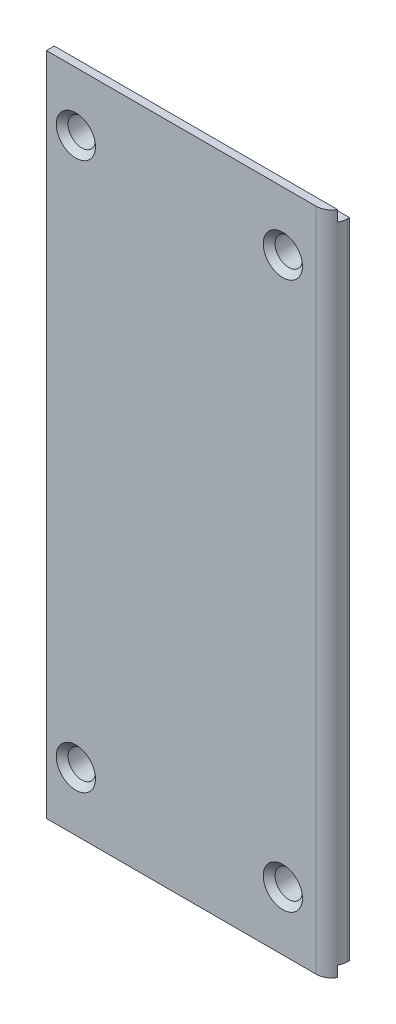
ISO-10303-21;
HEADER;
FILE_DESCRIPTION(('STEP AP214'),'2;1');
FILE_NAME('part.step','',(''),(''),'','','');
FILE_SCHEMA(('AUTOMOTIVE_DESIGN { 1 0 10303 214 1 1 1 1 }'));
ENDSEC;
DATA;
#1=APPLICATION_CONTEXT('core data for automotive mechanical design processes');
#2=APPLICATION_PROTOCOL_DEFINITION('international standard','automotive_design',2000,#1);
#3=PRODUCT_CONTEXT('',#1,'mechanical');
#4=PRODUCT('Part','Part','',(#3));
#5=PRODUCT_RELATED_PRODUCT_CATEGORY('part','',(#4));
#6=PRODUCT_DEFINITION_FORMATION('','',#4);
#7=PRODUCT_DEFINITION_CONTEXT('part definition',#1,'design');
#8=PRODUCT_DEFINITION('design','',#6,#7);
#9=PRODUCT_DEFINITION_SHAPE('','',#8);
#10=(LENGTH_UNIT() NAMED_UNIT(*) SI_UNIT(.MILLI.,.METRE.));
#11=(NAMED_UNIT(*) PLANE_ANGLE_UNIT() SI_UNIT($,.RADIAN.));
#12=(NAMED_UNIT(*) SI_UNIT($,.STERADIAN.) SOLID_ANGLE_UNIT());
#13=UNCERTAINTY_MEASURE_WITH_UNIT(LENGTH_MEASURE(1.E-05),#10,'distance_accuracy_value','');
#14=(GEOMETRIC_REPRESENTATION_CONTEXT(3) GLOBAL_UNCERTAINTY_ASSIGNED_CONTEXT((#13)) GLOBAL_UNIT_ASSIGNED_CONTEXT((#10,
#11,#12)) REPRESENTATION_CONTEXT('',''));
#15=CARTESIAN_POINT('',(0.,0.,0.));
#16=DIRECTION('',(0.,0.,1.));
#17=DIRECTION('',(1.,0.,0.));
#18=AXIS2_PLACEMENT_3D('',#15,#16,#17);
#19=CARTESIAN_POINT('',(0.,0.,-1.));
#20=DIRECTION('',(0.,0.,-1.));
#21=DIRECTION('',(-1.,0.,0.));
#22=AXIS2_PLACEMENT_3D('',#19,#20,#21);
#23=PLANE('',#22);
#24=CARTESIAN_POINT('',(-11.55,27.9,-1.));
#25=DIRECTION('',(0.,0.,-1.));
#26=DIRECTION('',(-1.,0.,0.));
#27=AXIS2_PLACEMENT_3D('',#24,#25,#26);
#28=CIRCLE('',#27,2.4);
#29=CARTESIAN_POINT('',(-13.95,27.9,-1.));
#30=VERTEX_POINT('',#29);
#31=EDGE_CURVE('E248',#30,#30,#28,.T.);
#32=ORIENTED_EDGE('',*,*,#31,.F.);
#33=EDGE_LOOP('',(#32));
#34=FACE_BOUND('',#33,.T.);
#35=CARTESIAN_POINT('',(-11.55,-27.9,-1.));
#36=DIRECTION('',(0.,0.,-1.));
#37=DIRECTION('',(-1.,0.,0.));
#38=AXIS2_PLACEMENT_3D('',#35,#36,#37);
#39=CIRCLE('',#38,2.4);
#40=CARTESIAN_POINT('',(-13.95,-27.9,-1.));
#41=VERTEX_POINT('',#40);
#42=EDGE_CURVE('E236',#41,#41,#39,.T.);
#43=ORIENTED_EDGE('',*,*,#42,.F.);
#44=EDGE_LOOP('',(#43));
#45=FACE_BOUND('',#44,.T.);
#46=DIRECTION('',(0.,-1.,0.));
#47=VECTOR('',#46,1.);
#48=CARTESIAN_POINT('',(10.45,0.,-1.));
#49=LINE('',#48,#47);
#50=CARTESIAN_POINT('',(10.45,25.6751404538713,-1.));
#51=VERTEX_POINT('',#50);
#52=CARTESIAN_POINT('',(10.45,-25.6751404538713,-1.));
#53=VERTEX_POINT('',#52);
#54=EDGE_CURVE('E211',#51,#53,#49,.T.);
#55=ORIENTED_EDGE('',*,*,#54,.T.);
#56=CARTESIAN_POINT('',(9.55,-27.9,-1.));
#57=DIRECTION('',(0.,0.,-1.));
#58=DIRECTION('',(-1.,0.,0.));
#59=AXIS2_PLACEMENT_3D('',#56,#57,#58);
#60=CIRCLE('',#59,2.4);
#61=CARTESIAN_POINT('',(10.45,-30.1248595461287,-1.));
#62=VERTEX_POINT('',#61);
#63=EDGE_CURVE('E216',#62,#53,#60,.T.);
#64=ORIENTED_EDGE('',*,*,#63,.F.);
#65=DIRECTION('',(0.,-1.,0.));
#66=VECTOR('',#65,1.);
#67=CARTESIAN_POINT('',(10.45,0.,-1.));
#68=LINE('',#67,#66);
#69=CARTESIAN_POINT('',(10.45,-32.8,-1.));
#70=VERTEX_POINT('',#69);
#71=EDGE_CURVE('E200',#62,#70,#68,.T.);
#72=ORIENTED_EDGE('',*,*,#71,.T.);
#73=DIRECTION('',(-1.,0.,0.));
#74=VECTOR('',#73,1.);
#75=CARTESIAN_POINT('',(14.55,-32.8,-1.));
#76=LINE('',#75,#74);
#77=CARTESIAN_POINT('',(-14.55,-32.8,-1.));
#78=VERTEX_POINT('',#77);
#79=EDGE_CURVE('E289',#70,#78,#76,.T.);
#80=ORIENTED_EDGE('',*,*,#79,.T.);
#81=DIRECTION('',(0.,1.,0.));
#82=VECTOR('',#81,1.);
#83=CARTESIAN_POINT('',(-14.55,32.8,-1.));
#84=LINE('',#83,#82);
#85=CARTESIAN_POINT('',(-14.55,32.8,-1.));
#86=VERTEX_POINT('',#85);
#87=EDGE_CURVE('E295',#78,#86,#84,.T.);
#88=ORIENTED_EDGE('',*,*,#87,.T.);
#89=DIRECTION('',(1.,0.,0.));
#90=VECTOR('',#89,1.);
#91=CARTESIAN_POINT('',(14.55,32.8,-1.));
#92=LINE('',#91,#90);
#93=CARTESIAN_POINT('',(10.45,32.8,-1.));
#94=VERTEX_POINT('',#93);
#95=EDGE_CURVE('E299',#86,#94,#92,.T.);
#96=ORIENTED_EDGE('',*,*,#95,.T.);
#97=DIRECTION('',(0.,-1.,0.));
#98=VECTOR('',#97,1.);
#99=CARTESIAN_POINT('',(10.45,0.,-1.));
#100=LINE('',#99,#98);
#101=CARTESIAN_POINT('',(10.45,30.1248595461287,-1.));
#102=VERTEX_POINT('',#101);
#103=EDGE_CURVE('E386',#94,#102,#100,.T.);
#104=ORIENTED_EDGE('',*,*,#103,.T.);
#105=CARTESIAN_POINT('',(9.55,27.9,-1.));
#106=DIRECTION('',(0.,0.,-1.));
#107=DIRECTION('',(-1.,0.,0.));
#108=AXIS2_PLACEMENT_3D('',#105,#106,#107);
#109=CIRCLE('',#108,2.4);
#110=EDGE_CURVE('E263',#51,#102,#109,.T.);
#111=ORIENTED_EDGE('',*,*,#110,.F.);
#112=EDGE_LOOP('',(#55,#64,#72,#80,#88,#96,#104,#111));
#113=FACE_BOUND('',#112,.T.);
#114=ADVANCED_FACE('F80',(#34,#45,#113),#23,.T.);
#115=CARTESIAN_POINT('',(11.45,32.8,-1.99999999999999));
#116=DIRECTION('',(0.707106781186552,0.,0.707106781186543));
#117=DIRECTION('',(0.,1.,0.));
#118=AXIS2_PLACEMENT_3D('',#115,#116,#117);
#119=PLANE('',#118);
#120=CARTESIAN_POINT('',(9.55,-27.9,-0.0999999999999784));
#121=DIRECTION('',(0.707106781186552,0.,0.707106781186543));
#122=DIRECTION('',(-0.707106781186543,0.,0.707106781186552));
#123=AXIS2_PLACEMENT_3D('',#120,#121,#122);
#124=ELLIPSE('',#123,3.39411254969545,2.4);
#125=CARTESIAN_POINT('',(11.45,-26.4337121701385,-2.));
#126=VERTEX_POINT('',#125);
#127=EDGE_CURVE('E227',#53,#126,#124,.F.);
#128=ORIENTED_EDGE('',*,*,#127,.F.);
#129=ORIENTED_EDGE('',*,*,#54,.F.);
#130=CARTESIAN_POINT('',(9.55,27.9,-0.099999999999971));
#131=DIRECTION('',(0.707106781186552,0.,0.707106781186543));
#132=DIRECTION('',(-0.707106781186543,0.,0.707106781186552));
#133=AXIS2_PLACEMENT_3D('',#130,#131,#132);
#134=ELLIPSE('',#133,3.39411254969545,2.4);
#135=CARTESIAN_POINT('',(11.45,26.4337121701385,-2.));
#136=VERTEX_POINT('',#135);
#137=EDGE_CURVE('E390',#136,#51,#134,.F.);
#138=ORIENTED_EDGE('',*,*,#137,.F.);
#139=DIRECTION('',(0.,1.,0.));
#140=VECTOR('',#139,1.);
#141=CARTESIAN_POINT('',(11.45,32.8,-2.));
#142=LINE('',#141,#140);
#143=EDGE_CURVE('E281',#126,#136,#142,.T.);
#144=ORIENTED_EDGE('',*,*,#143,.F.);
#145=EDGE_LOOP('',(#128,#129,#138,#144));
#146=FACE_BOUND('',#145,.T.);
#147=ADVANCED_FACE('F505',(#146),#119,.F.);
#148=CARTESIAN_POINT('',(11.45,-31.8,-2.));
#149=VERTEX_POINT('',#148);
#150=CARTESIAN_POINT('',(11.45,-29.3662878298615,-2.));
#151=VERTEX_POINT('',#150);
#152=EDGE_CURVE('E277',#149,#151,#142,.T.);
#153=ORIENTED_EDGE('',*,*,#152,.F.);
#154=DIRECTION('',(-0.577350269189623,-0.577350269189623,0.577350269189631));
#155=VECTOR('',#154,1.);
#156=CARTESIAN_POINT('',(7.63333333333336,-35.6166666666666,1.81666666666668));
#157=LINE('',#156,#155);
#158=EDGE_CURVE('E207',#149,#70,#157,.T.);
#159=ORIENTED_EDGE('',*,*,#158,.T.);
#160=ORIENTED_EDGE('',*,*,#71,.F.);
#161=EDGE_CURVE('E205',#151,#62,#124,.F.);
#162=ORIENTED_EDGE('',*,*,#161,.F.);
#163=EDGE_LOOP('',(#153,#159,#160,#162));
#164=FACE_BOUND('',#163,.T.);
#165=ADVANCED_FACE('F203',(#164),#119,.F.);
#166=ORIENTED_EDGE('',*,*,#103,.F.);
#167=DIRECTION('',(0.577350269189623,-0.577350269189623,-0.577350269189631));
#168=VECTOR('',#167,1.);
#169=CARTESIAN_POINT('',(7.63333333333337,35.6166666666667,1.81666666666669));
#170=LINE('',#169,#168);
#171=CARTESIAN_POINT('',(11.45,31.8,-2.));
#172=VERTEX_POINT('',#171);
#173=EDGE_CURVE('E417',#94,#172,#170,.T.);
#174=ORIENTED_EDGE('',*,*,#173,.T.);
#175=CARTESIAN_POINT('',(11.45,29.3662878298615,-2.));
#176=VERTEX_POINT('',#175);
#177=EDGE_CURVE('E276',#176,#172,#142,.T.);
#178=ORIENTED_EDGE('',*,*,#177,.F.);
#179=EDGE_CURVE('E394',#102,#176,#134,.F.);
#180=ORIENTED_EDGE('',*,*,#179,.F.);
#181=EDGE_LOOP('',(#166,#174,#178,#180));
#182=FACE_BOUND('',#181,.T.);
#183=ADVANCED_FACE('F515',(#182),#119,.F.);
#184=DIRECTION('',(0.,-1.,0.));
#185=VECTOR('',#184,1.);
#186=CARTESIAN_POINT('',(12.45,32.8,-1.));
#187=LINE('',#186,#185);
#188=CARTESIAN_POINT('',(12.45,32.8,-1.));
#189=VERTEX_POINT('',#188);
#190=CARTESIAN_POINT('',(12.45,-32.8,-1.));
#191=VERTEX_POINT('',#190);
#192=EDGE_CURVE('E268',#189,#191,#187,.T.);
#193=ORIENTED_EDGE('',*,*,#192,.F.);
#194=CARTESIAN_POINT('',(14.55,32.8,-1.));
#195=VERTEX_POINT('',#194);
#196=EDGE_CURVE('E298',#189,#195,#92,.T.);
#197=ORIENTED_EDGE('',*,*,#196,.T.);
#198=DIRECTION('',(0.,-1.,0.));
#199=VECTOR('',#198,1.);
#200=CARTESIAN_POINT('',(14.55,32.8,-1.));
#201=LINE('',#200,#199);
#202=CARTESIAN_POINT('',(14.55,-32.8,-1.));
#203=VERTEX_POINT('',#202);
#204=EDGE_CURVE('E285',#195,#203,#201,.T.);
#205=ORIENTED_EDGE('',*,*,#204,.T.);
#206=EDGE_CURVE('E291',#203,#191,#76,.T.);
#207=ORIENTED_EDGE('',*,*,#206,.T.);
#208=EDGE_LOOP('',(#193,#197,#205,#207));
#209=FACE_BOUND('',#208,.T.);
#210=ADVANCED_FACE('F463',(#209),#23,.T.);
#211=CARTESIAN_POINT('',(0.,0.,0.));
#212=DIRECTION('',(0.,0.,1.));
#213=DIRECTION('',(1.,0.,0.));
#214=AXIS2_PLACEMENT_3D('',#211,#212,#213);
#215=PLANE('',#214);
#216=DIRECTION('',(-1.,0.,0.));
#217=VECTOR('',#216,1.);
#218=CARTESIAN_POINT('',(-14.55,33.9,0.));
#219=LINE('',#218,#217);
#220=CARTESIAN_POINT('',(14.3356406460551,33.9,0.));
#221=VERTEX_POINT('',#220);
#222=CARTESIAN_POINT('',(-14.55,33.9,0.));
#223=VERTEX_POINT('',#222);
#224=EDGE_CURVE('E329',#221,#223,#219,.T.);
#225=ORIENTED_EDGE('',*,*,#224,.F.);
#226=DIRECTION('',(0.,-1.,0.));
#227=VECTOR('',#226,1.);
#228=CARTESIAN_POINT('',(14.3356406460551,33.9,0.));
#229=LINE('',#228,#227);
#230=CARTESIAN_POINT('',(14.3356406460551,32.8,0.));
#231=VERTEX_POINT('',#230);
#232=EDGE_CURVE('E427',#221,#231,#229,.T.);
#233=ORIENTED_EDGE('',*,*,#232,.T.);
#234=DIRECTION('',(1.,0.,0.));
#235=VECTOR('',#234,1.);
#236=CARTESIAN_POINT('',(14.55,32.8,0.));
#237=LINE('',#236,#235);
#238=CARTESIAN_POINT('',(-14.55,32.8,0.));
#239=VERTEX_POINT('',#238);
#240=EDGE_CURVE('E290',#239,#231,#237,.T.);
#241=ORIENTED_EDGE('',*,*,#240,.F.);
#242=DIRECTION('',(0.,-1.,0.));
#243=VECTOR('',#242,1.);
#244=CARTESIAN_POINT('',(-14.55,33.9,0.));
#245=LINE('',#244,#243);
#246=EDGE_CURVE('E337',#223,#239,#245,.T.);
#247=ORIENTED_EDGE('',*,*,#246,.F.);
#248=EDGE_LOOP('',(#225,#233,#241,#247));
#249=FACE_BOUND('',#248,.T.);
#250=ADVANCED_FACE('F493',(#249),#215,.F.);
#251=DIRECTION('',(-1.,0.,0.));
#252=VECTOR('',#251,1.);
#253=CARTESIAN_POINT('',(14.55,-32.8,0.));
#254=LINE('',#253,#252);
#255=CARTESIAN_POINT('',(14.3356406460551,-32.8,0.));
#256=VERTEX_POINT('',#255);
#257=CARTESIAN_POINT('',(-14.55,-32.8,0.));
#258=VERTEX_POINT('',#257);
#259=EDGE_CURVE('E280',#256,#258,#254,.T.);
#260=ORIENTED_EDGE('',*,*,#259,.F.);
#261=DIRECTION('',(0.,-1.,0.));
#262=VECTOR('',#261,1.);
#263=CARTESIAN_POINT('',(14.3356406460551,-32.8,0.));
#264=LINE('',#263,#262);
#265=CARTESIAN_POINT('',(14.3356406460551,-33.9,0.));
#266=VERTEX_POINT('',#265);
#267=EDGE_CURVE('E89',#256,#266,#264,.T.);
#268=ORIENTED_EDGE('',*,*,#267,.T.);
#269=DIRECTION('',(1.,0.,0.));
#270=VECTOR('',#269,1.);
#271=CARTESIAN_POINT('',(-14.55,-33.9,0.));
#272=LINE('',#271,#270);
#273=CARTESIAN_POINT('',(-14.55,-33.9,0.));
#274=VERTEX_POINT('',#273);
#275=EDGE_CURVE('E341',#274,#266,#272,.T.);
#276=ORIENTED_EDGE('',*,*,#275,.F.);
#277=EDGE_CURVE('E323',#258,#274,#245,.T.);
#278=ORIENTED_EDGE('',*,*,#277,.F.);
#279=EDGE_LOOP('',(#260,#268,#276,#278));
#280=FACE_BOUND('',#279,.T.);
#281=ADVANCED_FACE('F491',(#280),#215,.F.);
#282=CARTESIAN_POINT('',(-14.55,33.9,0.8));
#283=DIRECTION('',(1.,0.,0.));
#284=DIRECTION('',(0.,1.,0.));
#285=AXIS2_PLACEMENT_3D('',#282,#283,#284);
#286=PLANE('',#285);
#287=ORIENTED_EDGE('',*,*,#246,.T.);
#288=DIRECTION('',(0.,0.,1.));
#289=VECTOR('',#288,1.);
#290=CARTESIAN_POINT('',(-14.55,32.8,-1.));
#291=LINE('',#290,#289);
#292=EDGE_CURVE('E312',#86,#239,#291,.T.);
#293=ORIENTED_EDGE('',*,*,#292,.F.);
#294=ORIENTED_EDGE('',*,*,#87,.F.);
#295=DIRECTION('',(0.,0.,1.));
#296=VECTOR('',#295,1.);
#297=CARTESIAN_POINT('',(-14.55,-32.8,-1.));
#298=LINE('',#297,#296);
#299=EDGE_CURVE('E316',#78,#258,#298,.T.);
#300=ORIENTED_EDGE('',*,*,#299,.T.);
#301=ORIENTED_EDGE('',*,*,#277,.T.);
#302=DIRECTION('',(0.,0.,-1.));
#303=VECTOR('',#302,1.);
#304=CARTESIAN_POINT('',(-14.55,-33.9,0.8));
#305=LINE('',#304,#303);
#306=CARTESIAN_POINT('',(-14.55,-33.9,0.8));
#307=VERTEX_POINT('',#306);
#308=EDGE_CURVE('E349',#307,#274,#305,.T.);
#309=ORIENTED_EDGE('',*,*,#308,.F.);
#310=DIRECTION('',(0.,-1.,0.));
#311=VECTOR('',#310,1.);
#312=CARTESIAN_POINT('',(-14.55,33.9,0.8));
#313=LINE('',#312,#311);
#314=CARTESIAN_POINT('',(-14.55,33.9,0.8));
#315=VERTEX_POINT('',#314);
#316=EDGE_CURVE('E324',#315,#307,#313,.T.);
#317=ORIENTED_EDGE('',*,*,#316,.F.);
#318=DIRECTION('',(0.,0.,-1.));
#319=VECTOR('',#318,1.);
#320=CARTESIAN_POINT('',(-14.55,33.9,0.8));
#321=LINE('',#320,#319);
#322=EDGE_CURVE('E336',#315,#223,#321,.T.);
#323=ORIENTED_EDGE('',*,*,#322,.T.);
#324=EDGE_LOOP('',(#287,#293,#294,#300,#301,#309,#317,#323));
#325=FACE_BOUND('',#324,.T.);
#326=ADVANCED_FACE('F487',(#325),#286,.F.);
#327=CARTESIAN_POINT('',(-14.55,-33.9,0.8));
#328=DIRECTION('',(0.,1.,0.));
#329=DIRECTION('',(0.,0.,1.));
#330=AXIS2_PLACEMENT_3D('',#327,#328,#329);
#331=PLANE('',#330);
#332=ORIENTED_EDGE('',*,*,#275,.T.);
#333=CARTESIAN_POINT('',(12.95,-33.9,-0.8));
#334=DIRECTION('',(0.,1.,0.));
#335=DIRECTION('',(0.,0.,1.));
#336=AXIS2_PLACEMENT_3D('',#333,#334,#335);
#337=CIRCLE('',#336,1.6);
#338=CARTESIAN_POINT('',(12.95,-33.9,0.8));
#339=VERTEX_POINT('',#338);
#340=EDGE_CURVE('E12',#266,#339,#337,.F.);
#341=ORIENTED_EDGE('',*,*,#340,.T.);
#342=DIRECTION('',(1.,0.,0.));
#343=VECTOR('',#342,1.);
#344=CARTESIAN_POINT('',(-14.55,-33.9,0.8));
#345=LINE('',#344,#343);
#346=EDGE_CURVE('E328',#307,#339,#345,.T.);
#347=ORIENTED_EDGE('',*,*,#346,.F.);
#348=ORIENTED_EDGE('',*,*,#308,.T.);
#349=EDGE_LOOP('',(#332,#341,#347,#348));
#350=FACE_BOUND('',#349,.T.);
#351=ADVANCED_FACE('F479',(#350),#331,.F.);
#352=CARTESIAN_POINT('',(14.55,33.9,0.8));
#353=DIRECTION('',(-1.,0.,0.));
#354=DIRECTION('',(0.,0.,1.));
#355=AXIS2_PLACEMENT_3D('',#352,#353,#354);
#356=PLANE('',#355);
#357=DIRECTION('',(0.,0.,1.));
#358=VECTOR('',#357,1.);
#359=CARTESIAN_POINT('',(14.55,32.8,-1.));
#360=LINE('',#359,#358);
#361=CARTESIAN_POINT('',(14.55,32.8,-0.8));
#362=VERTEX_POINT('',#361);
#363=EDGE_CURVE('E303',#195,#362,#360,.T.);
#364=ORIENTED_EDGE('',*,*,#363,.T.);
#365=DIRECTION('',(0.,1.,0.));
#366=VECTOR('',#365,1.);
#367=CARTESIAN_POINT('',(14.55,-33.9,-0.8));
#368=LINE('',#367,#366);
#369=CARTESIAN_POINT('',(14.55,-32.8,-0.8));
#370=VERTEX_POINT('',#369);
#371=EDGE_CURVE('E433',#362,#370,#368,.F.);
#372=ORIENTED_EDGE('',*,*,#371,.T.);
#373=DIRECTION('',(0.,0.,1.));
#374=VECTOR('',#373,1.);
#375=CARTESIAN_POINT('',(14.55,-32.8,-1.));
#376=LINE('',#375,#374);
#377=EDGE_CURVE('E320',#203,#370,#376,.T.);
#378=ORIENTED_EDGE('',*,*,#377,.F.);
#379=ORIENTED_EDGE('',*,*,#204,.F.);
#380=EDGE_LOOP('',(#364,#372,#378,#379));
#381=FACE_BOUND('',#380,.T.);
#382=ADVANCED_FACE('F473',(#381),#356,.F.);
#383=CARTESIAN_POINT('',(-14.55,33.9,0.8));
#384=DIRECTION('',(0.,-1.,0.));
#385=DIRECTION('',(0.,0.,-1.));
#386=AXIS2_PLACEMENT_3D('',#383,#384,#385);
#387=PLANE('',#386);
#388=DIRECTION('',(-1.,0.,0.));
#389=VECTOR('',#388,1.);
#390=CARTESIAN_POINT('',(-14.55,33.9,0.8));
#391=LINE('',#390,#389);
#392=CARTESIAN_POINT('',(12.95,33.9,0.8));
#393=VERTEX_POINT('',#392);
#394=EDGE_CURVE('E333',#393,#315,#391,.T.);
#395=ORIENTED_EDGE('',*,*,#394,.F.);
#396=CARTESIAN_POINT('',(12.95,33.9,-0.8));
#397=DIRECTION('',(0.,-1.,0.));
#398=DIRECTION('',(0.,0.,-1.));
#399=AXIS2_PLACEMENT_3D('',#396,#397,#398);
#400=CIRCLE('',#399,1.6);
#401=EDGE_CURVE('E424',#393,#221,#400,.F.);
#402=ORIENTED_EDGE('',*,*,#401,.T.);
#403=ORIENTED_EDGE('',*,*,#224,.T.);
#404=ORIENTED_EDGE('',*,*,#322,.F.);
#405=EDGE_LOOP('',(#395,#402,#403,#404));
#406=FACE_BOUND('',#405,.T.);
#407=ADVANCED_FACE('F575',(#406),#387,.F.);
#408=CARTESIAN_POINT('',(0.,0.,0.8));
#409=DIRECTION('',(0.,0.,1.));
#410=DIRECTION('',(1.,0.,0.));
#411=AXIS2_PLACEMENT_3D('',#408,#409,#410);
#412=PLANE('',#411);
#413=CARTESIAN_POINT('',(-11.55,-27.9,0.8));
#414=DIRECTION('',(0.,0.,1.));
#415=DIRECTION('',(1.,0.,0.));
#416=AXIS2_PLACEMENT_3D('',#413,#414,#415);
#417=CIRCLE('',#416,1.99999999999999);
#418=CARTESIAN_POINT('',(-9.55000000000001,-27.9,0.8));
#419=VERTEX_POINT('',#418);
#420=EDGE_CURVE('E369',#419,#419,#417,.F.);
#421=ORIENTED_EDGE('',*,*,#420,.T.);
#422=EDGE_LOOP('',(#421));
#423=FACE_BOUND('',#422,.T.);
#424=CARTESIAN_POINT('',(9.55,-27.9,0.8));
#425=DIRECTION('',(0.,0.,1.));
#426=DIRECTION('',(1.,0.,0.));
#427=AXIS2_PLACEMENT_3D('',#424,#425,#426);
#428=CIRCLE('',#427,1.99999999999999);
#429=CARTESIAN_POINT('',(11.55,-27.9,0.8));
#430=VERTEX_POINT('',#429);
#431=EDGE_CURVE('E365',#430,#430,#428,.F.);
#432=ORIENTED_EDGE('',*,*,#431,.T.);
#433=EDGE_LOOP('',(#432));
#434=FACE_BOUND('',#433,.T.);
#435=CARTESIAN_POINT('',(-11.55,27.9,0.8));
#436=DIRECTION('',(0.,0.,1.));
#437=DIRECTION('',(1.,0.,0.));
#438=AXIS2_PLACEMENT_3D('',#435,#436,#437);
#439=CIRCLE('',#438,1.99999999999999);
#440=CARTESIAN_POINT('',(-9.55000000000001,27.9,0.8));
#441=VERTEX_POINT('',#440);
#442=EDGE_CURVE('E361',#441,#441,#439,.F.);
#443=ORIENTED_EDGE('',*,*,#442,.T.);
#444=EDGE_LOOP('',(#443));
#445=FACE_BOUND('',#444,.T.);
#446=CARTESIAN_POINT('',(9.55,27.9,0.8));
#447=DIRECTION('',(0.,0.,1.));
#448=DIRECTION('',(1.,0.,0.));
#449=AXIS2_PLACEMENT_3D('',#446,#447,#448);
#450=CIRCLE('',#449,1.99999999999999);
#451=CARTESIAN_POINT('',(11.55,27.9,0.8));
#452=VERTEX_POINT('',#451);
#453=EDGE_CURVE('E357',#452,#452,#450,.F.);
#454=ORIENTED_EDGE('',*,*,#453,.T.);
#455=EDGE_LOOP('',(#454));
#456=FACE_BOUND('',#455,.T.);
#457=ORIENTED_EDGE('',*,*,#346,.T.);
#458=DIRECTION('',(0.,1.,0.));
#459=VECTOR('',#458,1.);
#460=CARTESIAN_POINT('',(12.95,33.9,0.8));
#461=LINE('',#460,#459);
#462=EDGE_CURVE('E420',#339,#393,#461,.T.);
#463=ORIENTED_EDGE('',*,*,#462,.T.);
#464=ORIENTED_EDGE('',*,*,#394,.T.);
#465=ORIENTED_EDGE('',*,*,#316,.T.);
#466=EDGE_LOOP('',(#457,#463,#464,#465));
#467=FACE_BOUND('',#466,.T.);
#468=ADVANCED_FACE('F481',(#423,#434,#445,#456,#467),#412,.T.);
#469=CARTESIAN_POINT('',(14.55,-32.8,-1.));
#470=DIRECTION('',(0.,1.,0.));
#471=DIRECTION('',(0.,0.,1.));
#472=AXIS2_PLACEMENT_3D('',#469,#470,#471);
#473=PLANE('',#472);
#474=ORIENTED_EDGE('',*,*,#377,.T.);
#475=CARTESIAN_POINT('',(12.95,-32.8,-0.8));
#476=DIRECTION('',(0.,1.,0.));
#477=DIRECTION('',(0.,0.,1.));
#478=AXIS2_PLACEMENT_3D('',#475,#476,#477);
#479=CIRCLE('',#478,1.6);
#480=EDGE_CURVE('E103',#370,#256,#479,.F.);
#481=ORIENTED_EDGE('',*,*,#480,.T.);
#482=ORIENTED_EDGE('',*,*,#259,.T.);
#483=ORIENTED_EDGE('',*,*,#299,.F.);
#484=ORIENTED_EDGE('',*,*,#79,.F.);
#485=DIRECTION('',(1.,0.,0.));
#486=VECTOR('',#485,1.);
#487=CARTESIAN_POINT('',(12.45,-32.8,-0.999999999999985));
#488=LINE('',#487,#486);
#489=EDGE_CURVE('E405',#70,#191,#488,.T.);
#490=ORIENTED_EDGE('',*,*,#489,.T.);
#491=ORIENTED_EDGE('',*,*,#206,.F.);
#492=EDGE_LOOP('',(#474,#481,#482,#483,#484,#490,#491));
#493=FACE_BOUND('',#492,.T.);
#494=ADVANCED_FACE('F474',(#493),#473,.F.);
#495=CARTESIAN_POINT('',(14.55,32.8,-1.));
#496=DIRECTION('',(0.,-1.,0.));
#497=DIRECTION('',(0.,0.,-1.));
#498=AXIS2_PLACEMENT_3D('',#495,#496,#497);
#499=PLANE('',#498);
#500=ORIENTED_EDGE('',*,*,#240,.T.);
#501=CARTESIAN_POINT('',(12.95,32.8,-0.8));
#502=DIRECTION('',(0.,-1.,0.));
#503=DIRECTION('',(0.,0.,-1.));
#504=AXIS2_PLACEMENT_3D('',#501,#502,#503);
#505=CIRCLE('',#504,1.6);
#506=EDGE_CURVE('E430',#231,#362,#505,.F.);
#507=ORIENTED_EDGE('',*,*,#506,.T.);
#508=ORIENTED_EDGE('',*,*,#363,.F.);
#509=ORIENTED_EDGE('',*,*,#196,.F.);
#510=DIRECTION('',(-1.,0.,0.));
#511=VECTOR('',#510,1.);
#512=CARTESIAN_POINT('',(11.45,32.8,-0.999999999999985));
#513=LINE('',#512,#511);
#514=EDGE_CURVE('E414',#189,#94,#513,.T.);
#515=ORIENTED_EDGE('',*,*,#514,.T.);
#516=ORIENTED_EDGE('',*,*,#95,.F.);
#517=ORIENTED_EDGE('',*,*,#292,.T.);
#518=EDGE_LOOP('',(#500,#507,#508,#509,#515,#516,#517));
#519=FACE_BOUND('',#518,.T.);
#520=ADVANCED_FACE('F466',(#519),#499,.F.);
#521=CARTESIAN_POINT('',(-11.55,27.9,-1.));
#522=DIRECTION('',(0.,0.,1.));
#523=DIRECTION('',(1.,0.,0.));
#524=AXIS2_PLACEMENT_3D('',#521,#522,#523);
#525=CYLINDRICAL_SURFACE('',#524,1.4);
#526=CARTESIAN_POINT('',(-11.55,27.9,0.200000000000013));
#527=DIRECTION('',(0.,0.,1.));
#528=DIRECTION('',(1.,0.,0.));
#529=AXIS2_PLACEMENT_3D('',#526,#527,#528);
#530=CIRCLE('',#529,1.4);
#531=CARTESIAN_POINT('',(-10.15,27.9,0.200000000000013));
#532=VERTEX_POINT('',#531);
#533=EDGE_CURVE('E377',#532,#532,#530,.T.);
#534=ORIENTED_EDGE('',*,*,#533,.T.);
#535=EDGE_LOOP('',(#534));
#536=FACE_BOUND('',#535,.T.);
#537=CARTESIAN_POINT('',(-11.55,27.9,-2.));
#538=DIRECTION('',(0.,0.,-1.));
#539=DIRECTION('',(-1.,0.,0.));
#540=AXIS2_PLACEMENT_3D('',#537,#538,#539);
#541=CIRCLE('',#540,1.4);
#542=CARTESIAN_POINT('',(-12.95,27.9,-2.));
#543=VERTEX_POINT('',#542);
#544=EDGE_CURVE('E252',#543,#543,#541,.T.);
#545=ORIENTED_EDGE('',*,*,#544,.T.);
#546=EDGE_LOOP('',(#545));
#547=FACE_BOUND('',#546,.T.);
#548=ADVANCED_FACE('F563',(#536,#547),#525,.F.);
#549=CARTESIAN_POINT('',(9.55,27.9,-1.));
#550=DIRECTION('',(0.,0.,1.));
#551=DIRECTION('',(1.,0.,0.));
#552=AXIS2_PLACEMENT_3D('',#549,#550,#551);
#553=CYLINDRICAL_SURFACE('',#552,1.4);
#554=CARTESIAN_POINT('',(9.55,27.9,-2.));
#555=DIRECTION('',(0.,0.,-1.));
#556=DIRECTION('',(-1.,0.,0.));
#557=AXIS2_PLACEMENT_3D('',#554,#555,#556);
#558=CIRCLE('',#557,1.4);
#559=CARTESIAN_POINT('',(8.15,27.9,-2.));
#560=VERTEX_POINT('',#559);
#561=EDGE_CURVE('E259',#560,#560,#558,.T.);
#562=ORIENTED_EDGE('',*,*,#561,.T.);
#563=EDGE_LOOP('',(#562));
#564=FACE_BOUND('',#563,.T.);
#565=CARTESIAN_POINT('',(9.55,27.9,0.200000000000013));
#566=DIRECTION('',(0.,0.,1.));
#567=DIRECTION('',(1.,0.,0.));
#568=AXIS2_PLACEMENT_3D('',#565,#566,#567);
#569=CIRCLE('',#568,1.4);
#570=CARTESIAN_POINT('',(10.95,27.9,0.200000000000013));
#571=VERTEX_POINT('',#570);
#572=EDGE_CURVE('E212',#571,#571,#569,.T.);
#573=ORIENTED_EDGE('',*,*,#572,.T.);
#574=EDGE_LOOP('',(#573));
#575=FACE_BOUND('',#574,.T.);
#576=ADVANCED_FACE('F694',(#564,#575),#553,.F.);
#577=CARTESIAN_POINT('',(9.55,-27.9,-1.));
#578=DIRECTION('',(0.,0.,1.));
#579=DIRECTION('',(1.,0.,0.));
#580=AXIS2_PLACEMENT_3D('',#577,#578,#579);
#581=CYLINDRICAL_SURFACE('',#580,1.4);
#582=CARTESIAN_POINT('',(9.55,-27.9,0.200000000000013));
#583=DIRECTION('',(0.,0.,1.));
#584=DIRECTION('',(1.,0.,0.));
#585=AXIS2_PLACEMENT_3D('',#582,#583,#584);
#586=CIRCLE('',#585,1.4);
#587=CARTESIAN_POINT('',(10.95,-27.9,0.200000000000013));
#588=VERTEX_POINT('',#587);
#589=EDGE_CURVE('E373',#588,#588,#586,.T.);
#590=ORIENTED_EDGE('',*,*,#589,.T.);
#591=EDGE_LOOP('',(#590));
#592=FACE_BOUND('',#591,.T.);
#593=CARTESIAN_POINT('',(9.55,-27.9,-2.));
#594=DIRECTION('',(0.,0.,-1.));
#595=DIRECTION('',(-1.,0.,0.));
#596=AXIS2_PLACEMENT_3D('',#593,#594,#595);
#597=CIRCLE('',#596,1.4);
#598=CARTESIAN_POINT('',(8.15,-27.9,-2.));
#599=VERTEX_POINT('',#598);
#600=EDGE_CURVE('E221',#599,#599,#597,.T.);
#601=ORIENTED_EDGE('',*,*,#600,.T.);
#602=EDGE_LOOP('',(#601));
#603=FACE_BOUND('',#602,.T.);
#604=ADVANCED_FACE('F686',(#592,#603),#581,.F.);
#605=CARTESIAN_POINT('',(-11.55,-27.9,-1.));
#606=DIRECTION('',(0.,0.,1.));
#607=DIRECTION('',(1.,0.,0.));
#608=AXIS2_PLACEMENT_3D('',#605,#606,#607);
#609=CYLINDRICAL_SURFACE('',#608,1.4);
#610=CARTESIAN_POINT('',(-11.55,-27.9,0.200000000000013));
#611=DIRECTION('',(0.,0.,1.));
#612=DIRECTION('',(1.,0.,0.));
#613=AXIS2_PLACEMENT_3D('',#610,#611,#612);
#614=CIRCLE('',#613,1.4);
#615=CARTESIAN_POINT('',(-10.15,-27.9,0.200000000000013));
#616=VERTEX_POINT('',#615);
#617=EDGE_CURVE('E353',#616,#616,#614,.T.);
#618=ORIENTED_EDGE('',*,*,#617,.T.);
#619=EDGE_LOOP('',(#618));
#620=FACE_BOUND('',#619,.T.);
#621=CARTESIAN_POINT('',(-11.55,-27.9,-2.));
#622=DIRECTION('',(0.,0.,-1.));
#623=DIRECTION('',(-1.,0.,0.));
#624=AXIS2_PLACEMENT_3D('',#621,#622,#623);
#625=CIRCLE('',#624,1.4);
#626=CARTESIAN_POINT('',(-12.95,-27.9,-2.));
#627=VERTEX_POINT('',#626);
#628=EDGE_CURVE('E240',#627,#627,#625,.T.);
#629=ORIENTED_EDGE('',*,*,#628,.T.);
#630=EDGE_LOOP('',(#629));
#631=FACE_BOUND('',#630,.T.);
#632=ADVANCED_FACE('F678',(#620,#631),#609,.F.);
#633=CARTESIAN_POINT('',(-11.55,-27.9,0.200000000000013));
#634=DIRECTION('',(0.,0.,1.));
#635=DIRECTION('',(1.,0.,0.));
#636=AXIS2_PLACEMENT_3D('',#633,#634,#635);
#637=CONICAL_SURFACE('',#636,1.4,0.78539816339745);
#638=ORIENTED_EDGE('',*,*,#420,.F.);
#639=EDGE_LOOP('',(#638));
#640=FACE_BOUND('',#639,.T.);
#641=ORIENTED_EDGE('',*,*,#617,.F.);
#642=EDGE_LOOP('',(#641));
#643=FACE_BOUND('',#642,.T.);
#644=ADVANCED_FACE('F671',(#640,#643),#637,.F.);
#645=CARTESIAN_POINT('',(9.55,-27.9,0.200000000000013));
#646=DIRECTION('',(0.,0.,1.));
#647=DIRECTION('',(1.,0.,0.));
#648=AXIS2_PLACEMENT_3D('',#645,#646,#647);
#649=CONICAL_SURFACE('',#648,1.4,0.78539816339745);
#650=ORIENTED_EDGE('',*,*,#431,.F.);
#651=EDGE_LOOP('',(#650));
#652=FACE_BOUND('',#651,.T.);
#653=ORIENTED_EDGE('',*,*,#589,.F.);
#654=EDGE_LOOP('',(#653));
#655=FACE_BOUND('',#654,.T.);
#656=ADVANCED_FACE('F664',(#652,#655),#649,.F.);
#657=CARTESIAN_POINT('',(-11.55,27.9,0.200000000000013));
#658=DIRECTION('',(0.,0.,1.));
#659=DIRECTION('',(1.,0.,0.));
#660=AXIS2_PLACEMENT_3D('',#657,#658,#659);
#661=CONICAL_SURFACE('',#660,1.4,0.78539816339745);
#662=ORIENTED_EDGE('',*,*,#442,.F.);
#663=EDGE_LOOP('',(#662));
#664=FACE_BOUND('',#663,.T.);
#665=ORIENTED_EDGE('',*,*,#533,.F.);
#666=EDGE_LOOP('',(#665));
#667=FACE_BOUND('',#666,.T.);
#668=ADVANCED_FACE('F656',(#664,#667),#661,.F.);
#669=CARTESIAN_POINT('',(9.55,27.9,0.200000000000013));
#670=DIRECTION('',(0.,0.,1.));
#671=DIRECTION('',(1.,0.,0.));
#672=AXIS2_PLACEMENT_3D('',#669,#670,#671);
#673=CONICAL_SURFACE('',#672,1.4,0.78539816339745);
#674=ORIENTED_EDGE('',*,*,#453,.F.);
#675=EDGE_LOOP('',(#674));
#676=FACE_BOUND('',#675,.T.);
#677=ORIENTED_EDGE('',*,*,#572,.F.);
#678=EDGE_LOOP('',(#677));
#679=FACE_BOUND('',#678,.T.);
#680=ADVANCED_FACE('F537',(#676,#679),#673,.F.);
#681=CARTESIAN_POINT('',(12.45,32.8,-2.));
#682=DIRECTION('',(-1.,0.,0.));
#683=DIRECTION('',(0.,-1.,0.));
#684=AXIS2_PLACEMENT_3D('',#681,#682,#683);
#685=PLANE('',#684);
#686=ORIENTED_EDGE('',*,*,#192,.T.);
#687=DIRECTION('',(0.,0.707106781186543,-0.707106781186552));
#688=VECTOR('',#687,1.);
#689=CARTESIAN_POINT('',(12.45,-31.8,-2.));
#690=LINE('',#689,#688);
#691=CARTESIAN_POINT('',(12.45,-31.8,-2.));
#692=VERTEX_POINT('',#691);
#693=EDGE_CURVE('E411',#191,#692,#690,.T.);
#694=ORIENTED_EDGE('',*,*,#693,.T.);
#695=DIRECTION('',(0.,-1.,0.));
#696=VECTOR('',#695,1.);
#697=CARTESIAN_POINT('',(12.45,32.8,-2.));
#698=LINE('',#697,#696);
#699=CARTESIAN_POINT('',(12.45,31.8,-2.));
#700=VERTEX_POINT('',#699);
#701=EDGE_CURVE('E272',#700,#692,#698,.T.);
#702=ORIENTED_EDGE('',*,*,#701,.F.);
#703=DIRECTION('',(0.,0.707106781186543,0.707106781186552));
#704=VECTOR('',#703,1.);
#705=CARTESIAN_POINT('',(12.45,31.8,-2.));
#706=LINE('',#705,#704);
#707=EDGE_CURVE('E408',#700,#189,#706,.T.);
#708=ORIENTED_EDGE('',*,*,#707,.T.);
#709=EDGE_LOOP('',(#686,#694,#702,#708));
#710=FACE_BOUND('',#709,.T.);
#711=ADVANCED_FACE('F459',(#710),#685,.F.);
#712=CARTESIAN_POINT('',(0.,0.,-2.));
#713=DIRECTION('',(0.,0.,-1.));
#714=DIRECTION('',(-1.,0.,0.));
#715=AXIS2_PLACEMENT_3D('',#712,#713,#714);
#716=PLANE('',#715);
#717=ORIENTED_EDGE('',*,*,#701,.T.);
#718=DIRECTION('',(-1.,0.,0.));
#719=VECTOR('',#718,1.);
#720=CARTESIAN_POINT('',(11.45,-31.8,-2.));
#721=LINE('',#720,#719);
#722=EDGE_CURVE('E399',#692,#149,#721,.T.);
#723=ORIENTED_EDGE('',*,*,#722,.T.);
#724=ORIENTED_EDGE('',*,*,#152,.T.);
#725=CARTESIAN_POINT('',(9.55,-27.9,-2.));
#726=DIRECTION('',(0.,0.,-1.));
#727=DIRECTION('',(-1.,0.,0.));
#728=AXIS2_PLACEMENT_3D('',#725,#726,#727);
#729=CIRCLE('',#728,2.4);
#730=EDGE_CURVE('E222',#151,#126,#729,.T.);
#731=ORIENTED_EDGE('',*,*,#730,.T.);
#732=ORIENTED_EDGE('',*,*,#143,.T.);
#733=CARTESIAN_POINT('',(9.55,27.9,-2.));
#734=DIRECTION('',(0.,0.,-1.));
#735=DIRECTION('',(-1.,0.,0.));
#736=AXIS2_PLACEMENT_3D('',#733,#734,#735);
#737=CIRCLE('',#736,2.4);
#738=EDGE_CURVE('E264',#136,#176,#737,.T.);
#739=ORIENTED_EDGE('',*,*,#738,.T.);
#740=ORIENTED_EDGE('',*,*,#177,.T.);
#741=DIRECTION('',(1.,0.,0.));
#742=VECTOR('',#741,1.);
#743=CARTESIAN_POINT('',(12.45,31.8,-2.));
#744=LINE('',#743,#742);
#745=EDGE_CURVE('E395',#172,#700,#744,.T.);
#746=ORIENTED_EDGE('',*,*,#745,.T.);
#747=EDGE_LOOP('',(#717,#723,#724,#731,#732,#739,#740,#746));
#748=FACE_BOUND('',#747,.T.);
#749=ORIENTED_EDGE('',*,*,#561,.F.);
#750=EDGE_LOOP('',(#749));
#751=FACE_BOUND('',#750,.T.);
#752=ORIENTED_EDGE('',*,*,#600,.F.);
#753=EDGE_LOOP('',(#752));
#754=FACE_BOUND('',#753,.T.);
#755=ADVANCED_FACE('F448',(#748,#751,#754),#716,.T.);
#756=CARTESIAN_POINT('',(9.55,27.9,-2.));
#757=DIRECTION('',(0.,0.,1.));
#758=DIRECTION('',(1.,0.,0.));
#759=AXIS2_PLACEMENT_3D('',#756,#757,#758);
#760=CYLINDRICAL_SURFACE('',#759,2.4);
#761=ORIENTED_EDGE('',*,*,#110,.T.);
#762=ORIENTED_EDGE('',*,*,#179,.T.);
#763=ORIENTED_EDGE('',*,*,#738,.F.);
#764=ORIENTED_EDGE('',*,*,#137,.T.);
#765=EDGE_LOOP('',(#761,#762,#763,#764));
#766=FACE_BOUND('',#765,.T.);
#767=ADVANCED_FACE('F635',(#766),#760,.T.);
#768=CARTESIAN_POINT('',(-11.55,27.9,-2.));
#769=DIRECTION('',(0.,0.,-1.));
#770=DIRECTION('',(-1.,0.,0.));
#771=AXIS2_PLACEMENT_3D('',#768,#769,#770);
#772=PLANE('',#771);
#773=CARTESIAN_POINT('',(-11.55,27.9,-2.));
#774=DIRECTION('',(0.,0.,-1.));
#775=DIRECTION('',(-1.,0.,0.));
#776=AXIS2_PLACEMENT_3D('',#773,#774,#775);
#777=CIRCLE('',#776,2.4);
#778=CARTESIAN_POINT('',(-13.95,27.9,-2.));
#779=VERTEX_POINT('',#778);
#780=EDGE_CURVE('E247',#779,#779,#777,.T.);
#781=ORIENTED_EDGE('',*,*,#780,.T.);
#782=EDGE_LOOP('',(#781));
#783=FACE_BOUND('',#782,.T.);
#784=ORIENTED_EDGE('',*,*,#544,.F.);
#785=EDGE_LOOP('',(#784));
#786=FACE_BOUND('',#785,.T.);
#787=ADVANCED_FACE('F745',(#783,#786),#772,.T.);
#788=CARTESIAN_POINT('',(-11.55,27.9,-2.));
#789=DIRECTION('',(0.,0.,1.));
#790=DIRECTION('',(1.,0.,0.));
#791=AXIS2_PLACEMENT_3D('',#788,#789,#790);
#792=CYLINDRICAL_SURFACE('',#791,2.4);
#793=ORIENTED_EDGE('',*,*,#780,.F.);
#794=EDGE_LOOP('',(#793));
#795=FACE_BOUND('',#794,.T.);
#796=ORIENTED_EDGE('',*,*,#31,.T.);
#797=EDGE_LOOP('',(#796));
#798=FACE_BOUND('',#797,.T.);
#799=ADVANCED_FACE('F755',(#795,#798),#792,.T.);
#800=CARTESIAN_POINT('',(-11.55,-27.9,-2.));
#801=DIRECTION('',(0.,0.,-1.));
#802=DIRECTION('',(-1.,0.,0.));
#803=AXIS2_PLACEMENT_3D('',#800,#801,#802);
#804=PLANE('',#803);
#805=CARTESIAN_POINT('',(-11.55,-27.9,-2.));
#806=DIRECTION('',(0.,0.,-1.));
#807=DIRECTION('',(-1.,0.,0.));
#808=AXIS2_PLACEMENT_3D('',#805,#806,#807);
#809=CIRCLE('',#808,2.4);
#810=CARTESIAN_POINT('',(-13.95,-27.9,-2.));
#811=VERTEX_POINT('',#810);
#812=EDGE_CURVE('E231',#811,#811,#809,.T.);
#813=ORIENTED_EDGE('',*,*,#812,.T.);
#814=EDGE_LOOP('',(#813));
#815=FACE_BOUND('',#814,.T.);
#816=ORIENTED_EDGE('',*,*,#628,.F.);
#817=EDGE_LOOP('',(#816));
#818=FACE_BOUND('',#817,.T.);
#819=ADVANCED_FACE('F765',(#815,#818),#804,.T.);
#820=CARTESIAN_POINT('',(-11.55,-27.9,-2.));
#821=DIRECTION('',(0.,0.,1.));
#822=DIRECTION('',(1.,0.,0.));
#823=AXIS2_PLACEMENT_3D('',#820,#821,#822);
#824=CYLINDRICAL_SURFACE('',#823,2.4);
#825=ORIENTED_EDGE('',*,*,#812,.F.);
#826=EDGE_LOOP('',(#825));
#827=FACE_BOUND('',#826,.T.);
#828=ORIENTED_EDGE('',*,*,#42,.T.);
#829=EDGE_LOOP('',(#828));
#830=FACE_BOUND('',#829,.T.);
#831=ADVANCED_FACE('F775',(#827,#830),#824,.T.);
#832=CARTESIAN_POINT('',(9.55,-27.9,-2.));
#833=DIRECTION('',(0.,0.,1.));
#834=DIRECTION('',(1.,0.,0.));
#835=AXIS2_PLACEMENT_3D('',#832,#833,#834);
#836=CYLINDRICAL_SURFACE('',#835,2.4);
#837=ORIENTED_EDGE('',*,*,#63,.T.);
#838=ORIENTED_EDGE('',*,*,#127,.T.);
#839=ORIENTED_EDGE('',*,*,#730,.F.);
#840=ORIENTED_EDGE('',*,*,#161,.T.);
#841=EDGE_LOOP('',(#837,#838,#839,#840));
#842=FACE_BOUND('',#841,.T.);
#843=ADVANCED_FACE('F224',(#842),#836,.T.);
#844=CARTESIAN_POINT('',(0.,-31.8,-2.));
#845=DIRECTION('',(0.,-0.707106781186552,-0.707106781186542));
#846=DIRECTION('',(1.,0.,0.));
#847=AXIS2_PLACEMENT_3D('',#844,#845,#846);
#848=PLANE('',#847);
#849=ORIENTED_EDGE('',*,*,#693,.F.);
#850=ORIENTED_EDGE('',*,*,#489,.F.);
#851=ORIENTED_EDGE('',*,*,#158,.F.);
#852=ORIENTED_EDGE('',*,*,#722,.F.);
#853=EDGE_LOOP('',(#849,#850,#851,#852));
#854=FACE_BOUND('',#853,.T.);
#855=ADVANCED_FACE('F539',(#854),#848,.T.);
#856=CARTESIAN_POINT('',(0.,31.8,-2.));
#857=DIRECTION('',(0.,0.707106781186552,-0.707106781186542));
#858=DIRECTION('',(-1.,0.,0.));
#859=AXIS2_PLACEMENT_3D('',#856,#857,#858);
#860=PLANE('',#859);
#861=ORIENTED_EDGE('',*,*,#173,.F.);
#862=ORIENTED_EDGE('',*,*,#514,.F.);
#863=ORIENTED_EDGE('',*,*,#707,.F.);
#864=ORIENTED_EDGE('',*,*,#745,.F.);
#865=EDGE_LOOP('',(#861,#862,#863,#864));
#866=FACE_BOUND('',#865,.T.);
#867=ADVANCED_FACE('F455',(#866),#860,.T.);
#868=CARTESIAN_POINT('',(12.95,0.,-0.8));
#869=DIRECTION('',(0.,-1.,0.));
#870=DIRECTION('',(0.,0.,-1.));
#871=AXIS2_PLACEMENT_3D('',#868,#869,#870);
#872=CYLINDRICAL_SURFACE('',#871,1.6);
#873=ORIENTED_EDGE('',*,*,#480,.F.);
#874=ORIENTED_EDGE('',*,*,#371,.F.);
#875=ORIENTED_EDGE('',*,*,#506,.F.);
#876=ORIENTED_EDGE('',*,*,#232,.F.);
#877=ORIENTED_EDGE('',*,*,#401,.F.);
#878=ORIENTED_EDGE('',*,*,#462,.F.);
#879=ORIENTED_EDGE('',*,*,#340,.F.);
#880=ORIENTED_EDGE('',*,*,#267,.F.);
#881=EDGE_LOOP('',(#873,#874,#875,#876,#877,#878,#879,#880));
#882=FACE_BOUND('',#881,.T.);
#883=ADVANCED_FACE('F82',(#882),#872,.T.);
#884=CLOSED_SHELL('',(#114,#147,#165,#183,#210,#250,#281,#326,#351,#382,#407,#468,#494,#520,
#548,#576,#604,#632,#644,#656,#668,#680,#711,#755,#767,#787,#799,#819,#831,#843,#855,#867,#883));
#885=MANIFOLD_SOLID_BREP('B2',#884);
#886=ADVANCED_BREP_SHAPE_REPRESENTATION('',(#18,#885),#14);
#887=SHAPE_DEFINITION_REPRESENTATION(#9,#886);
ENDSEC;
END-ISO-10303-21;
